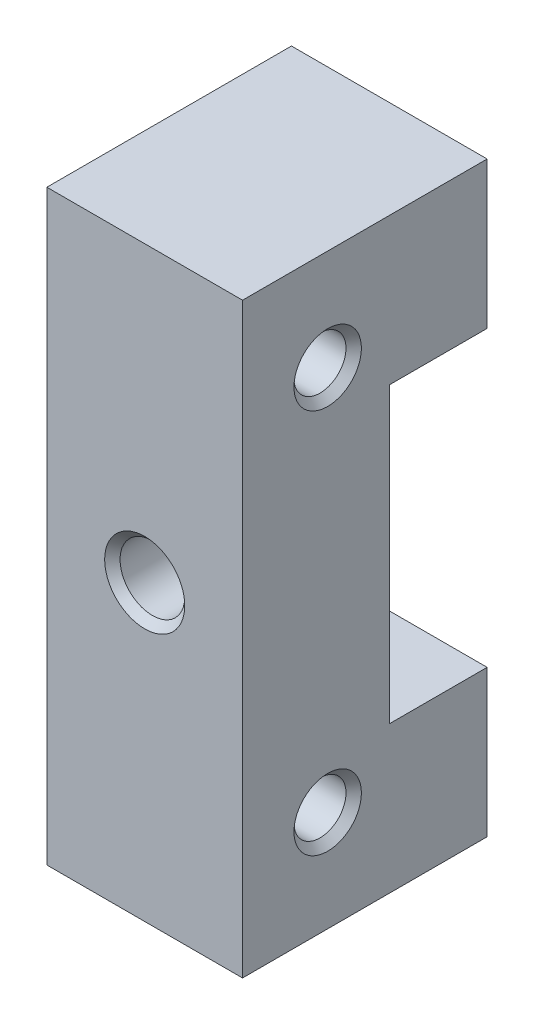
ISO-10303-21;
HEADER;
FILE_DESCRIPTION(('STEP AP214'),'2;1');
FILE_NAME('part.step','',(''),(''),'','','');
FILE_SCHEMA(('AUTOMOTIVE_DESIGN { 1 0 10303 214 1 1 1 1 }'));
ENDSEC;
DATA;
#1=APPLICATION_CONTEXT('core data for automotive mechanical design processes');
#2=APPLICATION_PROTOCOL_DEFINITION('international standard','automotive_design',2000,#1);
#3=PRODUCT_CONTEXT('',#1,'mechanical');
#4=PRODUCT('Part','Part','',(#3));
#5=PRODUCT_RELATED_PRODUCT_CATEGORY('part','',(#4));
#6=PRODUCT_DEFINITION_FORMATION('','',#4);
#7=PRODUCT_DEFINITION_CONTEXT('part definition',#1,'design');
#8=PRODUCT_DEFINITION('design','',#6,#7);
#9=PRODUCT_DEFINITION_SHAPE('','',#8);
#10=(LENGTH_UNIT() NAMED_UNIT(*) SI_UNIT(.MILLI.,.METRE.));
#11=(NAMED_UNIT(*) PLANE_ANGLE_UNIT() SI_UNIT($,.RADIAN.));
#12=(NAMED_UNIT(*) SI_UNIT($,.STERADIAN.) SOLID_ANGLE_UNIT());
#13=UNCERTAINTY_MEASURE_WITH_UNIT(LENGTH_MEASURE(1.E-05),#10,'distance_accuracy_value','');
#14=(GEOMETRIC_REPRESENTATION_CONTEXT(3) GLOBAL_UNCERTAINTY_ASSIGNED_CONTEXT((#13)) GLOBAL_UNIT_ASSIGNED_CONTEXT((#10,
#11,#12)) REPRESENTATION_CONTEXT('',''));
#15=CARTESIAN_POINT('',(0.,0.,0.));
#16=DIRECTION('',(0.,0.,1.));
#17=DIRECTION('',(1.,0.,0.));
#18=AXIS2_PLACEMENT_3D('',#15,#16,#17);
#19=CARTESIAN_POINT('',(12.7,317.5,44.45));
#20=DIRECTION('',(0.,0.,-1.));
#21=DIRECTION('',(-1.,0.,0.));
#22=AXIS2_PLACEMENT_3D('',#19,#20,#21);
#23=PLANE('',#22);
#24=CARTESIAN_POINT('',(0.,279.4,44.45));
#25=DIRECTION('',(0.,0.,-1.));
#26=DIRECTION('',(-1.,0.,0.));
#27=AXIS2_PLACEMENT_3D('',#24,#25,#26);
#28=CIRCLE('',#27,5.2);
#29=CARTESIAN_POINT('',(-5.2,279.4,44.45));
#30=VERTEX_POINT('',#29);
#31=EDGE_CURVE('E180',#30,#30,#28,.T.);
#32=ORIENTED_EDGE('',*,*,#31,.T.);
#33=EDGE_LOOP('',(#32));
#34=FACE_BOUND('',#33,.T.);
#35=DIRECTION('',(0.,-1.,0.));
#36=VECTOR('',#35,1.);
#37=CARTESIAN_POINT('',(-12.7,317.5,44.45));
#38=LINE('',#37,#36);
#39=CARTESIAN_POINT('',(-12.7,317.5,44.45));
#40=VERTEX_POINT('',#39);
#41=CARTESIAN_POINT('',(-12.7,241.3,44.45));
#42=VERTEX_POINT('',#41);
#43=EDGE_CURVE('E142',#40,#42,#38,.T.);
#44=ORIENTED_EDGE('',*,*,#43,.T.);
#45=DIRECTION('',(-1.,0.,0.));
#46=VECTOR('',#45,1.);
#47=CARTESIAN_POINT('',(12.7,241.3,44.45));
#48=LINE('',#47,#46);
#49=CARTESIAN_POINT('',(12.7,241.3,44.45));
#50=VERTEX_POINT('',#49);
#51=EDGE_CURVE('E169',#50,#42,#48,.T.);
#52=ORIENTED_EDGE('',*,*,#51,.F.);
#53=DIRECTION('',(0.,-1.,0.));
#54=VECTOR('',#53,1.);
#55=CARTESIAN_POINT('',(12.7,317.5,44.45));
#56=LINE('',#55,#54);
#57=CARTESIAN_POINT('',(12.7,317.5,44.45));
#58=VERTEX_POINT('',#57);
#59=EDGE_CURVE('E156',#58,#50,#56,.T.);
#60=ORIENTED_EDGE('',*,*,#59,.F.);
#61=DIRECTION('',(-1.,0.,0.));
#62=VECTOR('',#61,1.);
#63=CARTESIAN_POINT('',(12.7,317.5,44.45));
#64=LINE('',#63,#62);
#65=EDGE_CURVE('E138',#58,#40,#64,.T.);
#66=ORIENTED_EDGE('',*,*,#65,.T.);
#67=EDGE_LOOP('',(#44,#52,#60,#66));
#68=FACE_BOUND('',#67,.T.);
#69=ADVANCED_FACE('F43',(#34,#68),#23,.F.);
#70=CARTESIAN_POINT('',(12.7,241.3,44.45));
#71=DIRECTION('',(0.,1.,0.));
#72=DIRECTION('',(0.,0.,1.));
#73=AXIS2_PLACEMENT_3D('',#70,#71,#72);
#74=PLANE('',#73);
#75=DIRECTION('',(0.,0.,-1.));
#76=VECTOR('',#75,1.);
#77=CARTESIAN_POINT('',(-12.7,241.3,44.45));
#78=LINE('',#77,#76);
#79=CARTESIAN_POINT('',(-12.7,241.3,12.7));
#80=VERTEX_POINT('',#79);
#81=EDGE_CURVE('E145',#42,#80,#78,.T.);
#82=ORIENTED_EDGE('',*,*,#81,.T.);
#83=DIRECTION('',(-1.,0.,0.));
#84=VECTOR('',#83,1.);
#85=CARTESIAN_POINT('',(12.7,241.3,12.7));
#86=LINE('',#85,#84);
#87=CARTESIAN_POINT('',(12.7,241.3,12.7));
#88=VERTEX_POINT('',#87);
#89=EDGE_CURVE('E166',#88,#80,#86,.T.);
#90=ORIENTED_EDGE('',*,*,#89,.F.);
#91=DIRECTION('',(0.,0.,-1.));
#92=VECTOR('',#91,1.);
#93=CARTESIAN_POINT('',(12.7,241.3,44.45));
#94=LINE('',#93,#92);
#95=EDGE_CURVE('E105',#50,#88,#94,.T.);
#96=ORIENTED_EDGE('',*,*,#95,.F.);
#97=ORIENTED_EDGE('',*,*,#51,.T.);
#98=EDGE_LOOP('',(#82,#90,#96,#97));
#99=FACE_BOUND('',#98,.T.);
#100=ADVANCED_FACE('F232',(#99),#74,.F.);
#101=CARTESIAN_POINT('',(12.7,241.3,12.7));
#102=DIRECTION('',(0.,0.,1.));
#103=DIRECTION('',(0.,-1.,0.));
#104=AXIS2_PLACEMENT_3D('',#101,#102,#103);
#105=PLANE('',#104);
#106=DIRECTION('',(0.,1.,0.));
#107=VECTOR('',#106,1.);
#108=CARTESIAN_POINT('',(-12.7,241.3,12.7));
#109=LINE('',#108,#107);
#110=CARTESIAN_POINT('',(-12.7,260.35,12.7));
#111=VERTEX_POINT('',#110);
#112=EDGE_CURVE('E147',#80,#111,#109,.T.);
#113=ORIENTED_EDGE('',*,*,#112,.T.);
#114=DIRECTION('',(-1.,0.,0.));
#115=VECTOR('',#114,1.);
#116=CARTESIAN_POINT('',(12.7,260.35,12.7));
#117=LINE('',#116,#115);
#118=CARTESIAN_POINT('',(12.7,260.35,12.7));
#119=VERTEX_POINT('',#118);
#120=EDGE_CURVE('E163',#119,#111,#117,.T.);
#121=ORIENTED_EDGE('',*,*,#120,.F.);
#122=DIRECTION('',(0.,1.,0.));
#123=VECTOR('',#122,1.);
#124=CARTESIAN_POINT('',(12.7,241.3,12.7));
#125=LINE('',#124,#123);
#126=EDGE_CURVE('E423',#88,#119,#125,.T.);
#127=ORIENTED_EDGE('',*,*,#126,.F.);
#128=ORIENTED_EDGE('',*,*,#89,.T.);
#129=EDGE_LOOP('',(#113,#121,#127,#128));
#130=FACE_BOUND('',#129,.T.);
#131=ADVANCED_FACE('F239',(#130),#105,.F.);
#132=CARTESIAN_POINT('',(12.7,260.35,12.7));
#133=DIRECTION('',(0.,-1.,0.));
#134=DIRECTION('',(0.,0.,-1.));
#135=AXIS2_PLACEMENT_3D('',#132,#133,#134);
#136=PLANE('',#135);
#137=DIRECTION('',(0.,0.,1.));
#138=VECTOR('',#137,1.);
#139=CARTESIAN_POINT('',(-12.7,260.35,12.7));
#140=LINE('',#139,#138);
#141=CARTESIAN_POINT('',(-12.7,260.35,25.4));
#142=VERTEX_POINT('',#141);
#143=EDGE_CURVE('E149',#111,#142,#140,.T.);
#144=ORIENTED_EDGE('',*,*,#143,.T.);
#145=DIRECTION('',(-1.,0.,0.));
#146=VECTOR('',#145,1.);
#147=CARTESIAN_POINT('',(12.7,260.35,25.4));
#148=LINE('',#147,#146);
#149=CARTESIAN_POINT('',(12.7,260.35,25.4));
#150=VERTEX_POINT('',#149);
#151=EDGE_CURVE('E160',#150,#142,#148,.T.);
#152=ORIENTED_EDGE('',*,*,#151,.F.);
#153=DIRECTION('',(0.,0.,1.));
#154=VECTOR('',#153,1.);
#155=CARTESIAN_POINT('',(12.7,260.35,12.7));
#156=LINE('',#155,#154);
#157=EDGE_CURVE('E420',#119,#150,#156,.T.);
#158=ORIENTED_EDGE('',*,*,#157,.F.);
#159=ORIENTED_EDGE('',*,*,#120,.T.);
#160=EDGE_LOOP('',(#144,#152,#158,#159));
#161=FACE_BOUND('',#160,.T.);
#162=ADVANCED_FACE('F316',(#161),#136,.F.);
#163=CARTESIAN_POINT('',(12.7,260.35,25.4));
#164=DIRECTION('',(0.,0.,1.));
#165=DIRECTION('',(1.,0.,0.));
#166=AXIS2_PLACEMENT_3D('',#163,#164,#165);
#167=PLANE('',#166);
#168=CARTESIAN_POINT('',(0.,279.4,25.4));
#169=DIRECTION('',(0.,0.,1.));
#170=DIRECTION('',(1.,0.,0.));
#171=AXIS2_PLACEMENT_3D('',#168,#169,#170);
#172=CIRCLE('',#171,5.19999999999998);
#173=CARTESIAN_POINT('',(5.19999999999998,279.4,25.4));
#174=VERTEX_POINT('',#173);
#175=EDGE_CURVE('E177',#174,#174,#172,.T.);
#176=ORIENTED_EDGE('',*,*,#175,.T.);
#177=EDGE_LOOP('',(#176));
#178=FACE_BOUND('',#177,.T.);
#179=DIRECTION('',(0.,1.,0.));
#180=VECTOR('',#179,1.);
#181=CARTESIAN_POINT('',(-12.7,260.35,25.4));
#182=LINE('',#181,#180);
#183=CARTESIAN_POINT('',(-12.7,298.45,25.4));
#184=VERTEX_POINT('',#183);
#185=EDGE_CURVE('E151',#142,#184,#182,.T.);
#186=ORIENTED_EDGE('',*,*,#185,.T.);
#187=DIRECTION('',(-1.,0.,0.));
#188=VECTOR('',#187,1.);
#189=CARTESIAN_POINT('',(12.7,298.45,25.4));
#190=LINE('',#189,#188);
#191=CARTESIAN_POINT('',(12.7,298.45,25.4));
#192=VERTEX_POINT('',#191);
#193=EDGE_CURVE('E133',#192,#184,#190,.T.);
#194=ORIENTED_EDGE('',*,*,#193,.F.);
#195=DIRECTION('',(0.,1.,0.));
#196=VECTOR('',#195,1.);
#197=CARTESIAN_POINT('',(12.7,260.35,25.4));
#198=LINE('',#197,#196);
#199=EDGE_CURVE('E124',#150,#192,#198,.T.);
#200=ORIENTED_EDGE('',*,*,#199,.F.);
#201=ORIENTED_EDGE('',*,*,#151,.T.);
#202=EDGE_LOOP('',(#186,#194,#200,#201));
#203=FACE_BOUND('',#202,.T.);
#204=ADVANCED_FACE('F313',(#178,#203),#167,.F.);
#205=CARTESIAN_POINT('',(12.7,298.45,25.4));
#206=DIRECTION('',(0.,1.,0.));
#207=DIRECTION('',(0.,0.,1.));
#208=AXIS2_PLACEMENT_3D('',#205,#206,#207);
#209=PLANE('',#208);
#210=DIRECTION('',(0.,0.,-1.));
#211=VECTOR('',#210,1.);
#212=CARTESIAN_POINT('',(-12.7,298.45,25.4));
#213=LINE('',#212,#211);
#214=CARTESIAN_POINT('',(-12.7,298.45,12.7));
#215=VERTEX_POINT('',#214);
#216=EDGE_CURVE('E132',#184,#215,#213,.T.);
#217=ORIENTED_EDGE('',*,*,#216,.T.);
#218=DIRECTION('',(-1.,0.,0.));
#219=VECTOR('',#218,1.);
#220=CARTESIAN_POINT('',(12.7,298.45,12.7));
#221=LINE('',#220,#219);
#222=CARTESIAN_POINT('',(12.7,298.45,12.7));
#223=VERTEX_POINT('',#222);
#224=EDGE_CURVE('E129',#223,#215,#221,.T.);
#225=ORIENTED_EDGE('',*,*,#224,.F.);
#226=DIRECTION('',(0.,0.,-1.));
#227=VECTOR('',#226,1.);
#228=CARTESIAN_POINT('',(12.7,298.45,25.4));
#229=LINE('',#228,#227);
#230=EDGE_CURVE('E118',#192,#223,#229,.T.);
#231=ORIENTED_EDGE('',*,*,#230,.F.);
#232=ORIENTED_EDGE('',*,*,#193,.T.);
#233=EDGE_LOOP('',(#217,#225,#231,#232));
#234=FACE_BOUND('',#233,.T.);
#235=ADVANCED_FACE('F130',(#234),#209,.F.);
#236=CARTESIAN_POINT('',(12.7,298.45,12.7));
#237=DIRECTION('',(0.,0.,1.));
#238=DIRECTION('',(0.,-1.,0.));
#239=AXIS2_PLACEMENT_3D('',#236,#237,#238);
#240=PLANE('',#239);
#241=DIRECTION('',(0.,1.,0.));
#242=VECTOR('',#241,1.);
#243=CARTESIAN_POINT('',(-12.7,298.45,12.7));
#244=LINE('',#243,#242);
#245=CARTESIAN_POINT('',(-12.7,317.5,12.7));
#246=VERTEX_POINT('',#245);
#247=EDGE_CURVE('E90',#215,#246,#244,.T.);
#248=ORIENTED_EDGE('',*,*,#247,.T.);
#249=DIRECTION('',(-1.,0.,0.));
#250=VECTOR('',#249,1.);
#251=CARTESIAN_POINT('',(12.7,317.5,12.7));
#252=LINE('',#251,#250);
#253=CARTESIAN_POINT('',(12.7,317.5,12.7));
#254=VERTEX_POINT('',#253);
#255=EDGE_CURVE('E134',#254,#246,#252,.T.);
#256=ORIENTED_EDGE('',*,*,#255,.F.);
#257=DIRECTION('',(0.,1.,0.));
#258=VECTOR('',#257,1.);
#259=CARTESIAN_POINT('',(12.7,298.45,12.7));
#260=LINE('',#259,#258);
#261=EDGE_CURVE('E122',#223,#254,#260,.T.);
#262=ORIENTED_EDGE('',*,*,#261,.F.);
#263=ORIENTED_EDGE('',*,*,#224,.T.);
#264=EDGE_LOOP('',(#248,#256,#262,#263));
#265=FACE_BOUND('',#264,.T.);
#266=ADVANCED_FACE('F136',(#265),#240,.F.);
#267=CARTESIAN_POINT('',(12.7,317.5,12.7));
#268=DIRECTION('',(0.,-1.,0.));
#269=DIRECTION('',(0.,0.,-1.));
#270=AXIS2_PLACEMENT_3D('',#267,#268,#269);
#271=PLANE('',#270);
#272=DIRECTION('',(0.,0.,1.));
#273=VECTOR('',#272,1.);
#274=CARTESIAN_POINT('',(-12.7,317.5,12.7));
#275=LINE('',#274,#273);
#276=EDGE_CURVE('E96',#246,#40,#275,.T.);
#277=ORIENTED_EDGE('',*,*,#276,.T.);
#278=ORIENTED_EDGE('',*,*,#65,.F.);
#279=DIRECTION('',(0.,0.,1.));
#280=VECTOR('',#279,1.);
#281=CARTESIAN_POINT('',(12.7,317.5,12.7));
#282=LINE('',#281,#280);
#283=EDGE_CURVE('E61',#254,#58,#282,.T.);
#284=ORIENTED_EDGE('',*,*,#283,.F.);
#285=ORIENTED_EDGE('',*,*,#255,.T.);
#286=EDGE_LOOP('',(#277,#278,#284,#285));
#287=FACE_BOUND('',#286,.T.);
#288=ADVANCED_FACE('F221',(#287),#271,.F.);
#289=CARTESIAN_POINT('',(12.7,0.,0.));
#290=DIRECTION('',(1.,0.,0.));
#291=DIRECTION('',(0.,0.,-1.));
#292=AXIS2_PLACEMENT_3D('',#289,#290,#291);
#293=PLANE('',#292);
#294=CARTESIAN_POINT('',(12.7,254.4,33.4));
#295=DIRECTION('',(1.,0.,0.));
#296=DIRECTION('',(0.,0.,-1.));
#297=AXIS2_PLACEMENT_3D('',#294,#295,#296);
#298=CIRCLE('',#297,4.3782);
#299=CARTESIAN_POINT('',(12.7,254.4,29.0218));
#300=VERTEX_POINT('',#299);
#301=EDGE_CURVE('E192',#300,#300,#298,.F.);
#302=ORIENTED_EDGE('',*,*,#301,.T.);
#303=EDGE_LOOP('',(#302));
#304=FACE_BOUND('',#303,.T.);
#305=CARTESIAN_POINT('',(12.7,304.4,33.4));
#306=DIRECTION('',(1.,0.,0.));
#307=DIRECTION('',(0.,0.,-1.));
#308=AXIS2_PLACEMENT_3D('',#305,#306,#307);
#309=CIRCLE('',#308,4.3782);
#310=CARTESIAN_POINT('',(12.7,304.4,29.0218));
#311=VERTEX_POINT('',#310);
#312=EDGE_CURVE('E189',#311,#311,#309,.F.);
#313=ORIENTED_EDGE('',*,*,#312,.T.);
#314=EDGE_LOOP('',(#313));
#315=FACE_BOUND('',#314,.T.);
#316=ORIENTED_EDGE('',*,*,#59,.T.);
#317=ORIENTED_EDGE('',*,*,#95,.T.);
#318=ORIENTED_EDGE('',*,*,#126,.T.);
#319=ORIENTED_EDGE('',*,*,#157,.T.);
#320=ORIENTED_EDGE('',*,*,#199,.T.);
#321=ORIENTED_EDGE('',*,*,#230,.T.);
#322=ORIENTED_EDGE('',*,*,#261,.T.);
#323=ORIENTED_EDGE('',*,*,#283,.T.);
#324=EDGE_LOOP('',(#316,#317,#318,#319,#320,#321,#322,#323));
#325=FACE_BOUND('',#324,.T.);
#326=ADVANCED_FACE('F120',(#304,#315,#325),#293,.T.);
#327=CARTESIAN_POINT('',(-12.7,0.,0.));
#328=DIRECTION('',(1.,0.,0.));
#329=DIRECTION('',(0.,0.,-1.));
#330=AXIS2_PLACEMENT_3D('',#327,#328,#329);
#331=PLANE('',#330);
#332=CARTESIAN_POINT('',(-12.7,254.4,33.4));
#333=DIRECTION('',(1.,0.,0.));
#334=DIRECTION('',(0.,0.,-1.));
#335=AXIS2_PLACEMENT_3D('',#332,#333,#334);
#336=CIRCLE('',#335,4.37819999999998);
#337=CARTESIAN_POINT('',(-12.7,254.4,29.0218));
#338=VERTEX_POINT('',#337);
#339=EDGE_CURVE('E198',#338,#338,#336,.T.);
#340=ORIENTED_EDGE('',*,*,#339,.T.);
#341=EDGE_LOOP('',(#340));
#342=FACE_BOUND('',#341,.T.);
#343=CARTESIAN_POINT('',(-12.7,304.4,33.4));
#344=DIRECTION('',(1.,0.,0.));
#345=DIRECTION('',(0.,0.,-1.));
#346=AXIS2_PLACEMENT_3D('',#343,#344,#345);
#347=CIRCLE('',#346,4.37819999999998);
#348=CARTESIAN_POINT('',(-12.7,304.4,29.0218));
#349=VERTEX_POINT('',#348);
#350=EDGE_CURVE('E195',#349,#349,#347,.T.);
#351=ORIENTED_EDGE('',*,*,#350,.T.);
#352=EDGE_LOOP('',(#351));
#353=FACE_BOUND('',#352,.T.);
#354=ORIENTED_EDGE('',*,*,#43,.F.);
#355=ORIENTED_EDGE('',*,*,#276,.F.);
#356=ORIENTED_EDGE('',*,*,#247,.F.);
#357=ORIENTED_EDGE('',*,*,#216,.F.);
#358=ORIENTED_EDGE('',*,*,#185,.F.);
#359=ORIENTED_EDGE('',*,*,#143,.F.);
#360=ORIENTED_EDGE('',*,*,#112,.F.);
#361=ORIENTED_EDGE('',*,*,#81,.F.);
#362=EDGE_LOOP('',(#354,#355,#356,#357,#358,#359,#360,#361));
#363=FACE_BOUND('',#362,.T.);
#364=ADVANCED_FACE('F210',(#342,#353,#363),#331,.F.);
#365=CARTESIAN_POINT('',(12.7,254.4,33.4));
#366=DIRECTION('',(1.,0.,0.));
#367=DIRECTION('',(0.,0.,-1.));
#368=AXIS2_PLACEMENT_3D('',#365,#366,#367);
#369=CYLINDRICAL_SURFACE('',#368,3.3782);
#370=CARTESIAN_POINT('',(11.7,254.4,33.4));
#371=DIRECTION('',(1.,0.,0.));
#372=DIRECTION('',(0.,0.,-1.));
#373=AXIS2_PLACEMENT_3D('',#370,#371,#372);
#374=CIRCLE('',#373,3.3782);
#375=CARTESIAN_POINT('',(11.7,254.4,30.0218));
#376=VERTEX_POINT('',#375);
#377=EDGE_CURVE('E186',#376,#376,#374,.T.);
#378=ORIENTED_EDGE('',*,*,#377,.T.);
#379=EDGE_LOOP('',(#378));
#380=FACE_BOUND('',#379,.T.);
#381=CARTESIAN_POINT('',(-11.7,254.4,33.4));
#382=DIRECTION('',(1.,0.,0.));
#383=DIRECTION('',(0.,0.,-1.));
#384=AXIS2_PLACEMENT_3D('',#381,#382,#383);
#385=CIRCLE('',#384,3.3782);
#386=CARTESIAN_POINT('',(-11.7,254.4,30.0218));
#387=VERTEX_POINT('',#386);
#388=EDGE_CURVE('E183',#387,#387,#385,.F.);
#389=ORIENTED_EDGE('',*,*,#388,.T.);
#390=EDGE_LOOP('',(#389));
#391=FACE_BOUND('',#390,.T.);
#392=ADVANCED_FACE('F213',(#380,#391),#369,.F.);
#393=CARTESIAN_POINT('',(12.7,304.4,33.4));
#394=DIRECTION('',(1.,0.,0.));
#395=DIRECTION('',(0.,0.,-1.));
#396=AXIS2_PLACEMENT_3D('',#393,#394,#395);
#397=CYLINDRICAL_SURFACE('',#396,3.3782);
#398=CARTESIAN_POINT('',(11.7,304.4,33.4));
#399=DIRECTION('',(1.,0.,0.));
#400=DIRECTION('',(0.,0.,-1.));
#401=AXIS2_PLACEMENT_3D('',#398,#399,#400);
#402=CIRCLE('',#401,3.3782);
#403=CARTESIAN_POINT('',(11.7,304.4,30.0218));
#404=VERTEX_POINT('',#403);
#405=EDGE_CURVE('E11',#404,#404,#402,.T.);
#406=ORIENTED_EDGE('',*,*,#405,.T.);
#407=EDGE_LOOP('',(#406));
#408=FACE_BOUND('',#407,.T.);
#409=CARTESIAN_POINT('',(-11.7,304.4,33.4));
#410=DIRECTION('',(1.,0.,0.));
#411=DIRECTION('',(0.,0.,-1.));
#412=AXIS2_PLACEMENT_3D('',#409,#410,#411);
#413=CIRCLE('',#412,3.3782);
#414=CARTESIAN_POINT('',(-11.7,304.4,30.0218));
#415=VERTEX_POINT('',#414);
#416=EDGE_CURVE('E53',#415,#415,#413,.F.);
#417=ORIENTED_EDGE('',*,*,#416,.T.);
#418=EDGE_LOOP('',(#417));
#419=FACE_BOUND('',#418,.T.);
#420=ADVANCED_FACE('F203',(#408,#419),#397,.F.);
#421=CARTESIAN_POINT('',(0.,279.4,25.4));
#422=DIRECTION('',(0.,0.,-1.));
#423=DIRECTION('',(-1.,0.,0.));
#424=AXIS2_PLACEMENT_3D('',#421,#422,#423);
#425=CYLINDRICAL_SURFACE('',#424,4.2);
#426=CARTESIAN_POINT('',(0.,279.4,26.4));
#427=DIRECTION('',(0.,0.,1.));
#428=DIRECTION('',(1.,0.,0.));
#429=AXIS2_PLACEMENT_3D('',#426,#427,#428);
#430=CIRCLE('',#429,4.2);
#431=CARTESIAN_POINT('',(4.19999999999999,279.4,26.4));
#432=VERTEX_POINT('',#431);
#433=EDGE_CURVE('E174',#432,#432,#430,.F.);
#434=ORIENTED_EDGE('',*,*,#433,.T.);
#435=EDGE_LOOP('',(#434));
#436=FACE_BOUND('',#435,.T.);
#437=CARTESIAN_POINT('',(0.,279.4,43.45));
#438=DIRECTION('',(0.,0.,-1.));
#439=DIRECTION('',(-1.,0.,0.));
#440=AXIS2_PLACEMENT_3D('',#437,#438,#439);
#441=CIRCLE('',#440,4.2);
#442=CARTESIAN_POINT('',(-4.2,279.4,43.45));
#443=VERTEX_POINT('',#442);
#444=EDGE_CURVE('E171',#443,#443,#441,.F.);
#445=ORIENTED_EDGE('',*,*,#444,.T.);
#446=EDGE_LOOP('',(#445));
#447=FACE_BOUND('',#446,.T.);
#448=ADVANCED_FACE('F251',(#436,#447),#425,.F.);
#449=CARTESIAN_POINT('',(0.,279.4,26.4));
#450=DIRECTION('',(0.,0.,-1.));
#451=DIRECTION('',(-1.,0.,0.));
#452=AXIS2_PLACEMENT_3D('',#449,#450,#451);
#453=CONICAL_SURFACE('',#452,4.2,0.785398163397447);
#454=ORIENTED_EDGE('',*,*,#175,.F.);
#455=EDGE_LOOP('',(#454));
#456=FACE_BOUND('',#455,.T.);
#457=ORIENTED_EDGE('',*,*,#433,.F.);
#458=EDGE_LOOP('',(#457));
#459=FACE_BOUND('',#458,.T.);
#460=ADVANCED_FACE('F244',(#456,#459),#453,.F.);
#461=CARTESIAN_POINT('',(0.,279.4,44.45));
#462=DIRECTION('',(0.,0.,1.));
#463=DIRECTION('',(1.,0.,0.));
#464=AXIS2_PLACEMENT_3D('',#461,#462,#463);
#465=CONICAL_SURFACE('',#464,5.2,0.785398163397444);
#466=ORIENTED_EDGE('',*,*,#444,.F.);
#467=EDGE_LOOP('',(#466));
#468=FACE_BOUND('',#467,.T.);
#469=ORIENTED_EDGE('',*,*,#31,.F.);
#470=EDGE_LOOP('',(#469));
#471=FACE_BOUND('',#470,.T.);
#472=ADVANCED_FACE('F250',(#468,#471),#465,.F.);
#473=CARTESIAN_POINT('',(11.7,254.4,33.4));
#474=DIRECTION('',(1.,0.,0.));
#475=DIRECTION('',(0.,0.,-1.));
#476=AXIS2_PLACEMENT_3D('',#473,#474,#475);
#477=CONICAL_SURFACE('',#476,3.3782,0.785398163397456);
#478=ORIENTED_EDGE('',*,*,#301,.F.);
#479=EDGE_LOOP('',(#478));
#480=FACE_BOUND('',#479,.T.);
#481=ORIENTED_EDGE('',*,*,#377,.F.);
#482=EDGE_LOOP('',(#481));
#483=FACE_BOUND('',#482,.T.);
#484=ADVANCED_FACE('F258',(#480,#483),#477,.F.);
#485=CARTESIAN_POINT('',(-12.7,254.4,33.4));
#486=DIRECTION('',(-1.,0.,0.));
#487=DIRECTION('',(0.,0.,1.));
#488=AXIS2_PLACEMENT_3D('',#485,#486,#487);
#489=CONICAL_SURFACE('',#488,4.37819999999998,0.785398163397445);
#490=ORIENTED_EDGE('',*,*,#388,.F.);
#491=EDGE_LOOP('',(#490));
#492=FACE_BOUND('',#491,.T.);
#493=ORIENTED_EDGE('',*,*,#339,.F.);
#494=EDGE_LOOP('',(#493));
#495=FACE_BOUND('',#494,.T.);
#496=ADVANCED_FACE('F265',(#492,#495),#489,.F.);
#497=CARTESIAN_POINT('',(11.7,304.4,33.4));
#498=DIRECTION('',(1.,0.,0.));
#499=DIRECTION('',(0.,0.,-1.));
#500=AXIS2_PLACEMENT_3D('',#497,#498,#499);
#501=CONICAL_SURFACE('',#500,3.3782,0.785398163397456);
#502=ORIENTED_EDGE('',*,*,#312,.F.);
#503=EDGE_LOOP('',(#502));
#504=FACE_BOUND('',#503,.T.);
#505=ORIENTED_EDGE('',*,*,#405,.F.);
#506=EDGE_LOOP('',(#505));
#507=FACE_BOUND('',#506,.T.);
#508=ADVANCED_FACE('F207',(#504,#507),#501,.F.);
#509=CARTESIAN_POINT('',(-12.7,304.4,33.4));
#510=DIRECTION('',(-1.,0.,0.));
#511=DIRECTION('',(0.,0.,1.));
#512=AXIS2_PLACEMENT_3D('',#509,#510,#511);
#513=CONICAL_SURFACE('',#512,4.37819999999998,0.785398163397445);
#514=ORIENTED_EDGE('',*,*,#416,.F.);
#515=EDGE_LOOP('',(#514));
#516=FACE_BOUND('',#515,.T.);
#517=ORIENTED_EDGE('',*,*,#350,.F.);
#518=EDGE_LOOP('',(#517));
#519=FACE_BOUND('',#518,.T.);
#520=ADVANCED_FACE('F46',(#516,#519),#513,.F.);
#521=CLOSED_SHELL('',(#69,#100,#131,#162,#204,#235,#266,#288,#326,#364,#392,#420,#448,#460,#472,
#484,#496,#508,#520));
#522=MANIFOLD_SOLID_BREP('B2',#521);
#523=ADVANCED_BREP_SHAPE_REPRESENTATION('',(#18,#522),#14);
#524=SHAPE_DEFINITION_REPRESENTATION(#9,#523);
ENDSEC;
END-ISO-10303-21;
